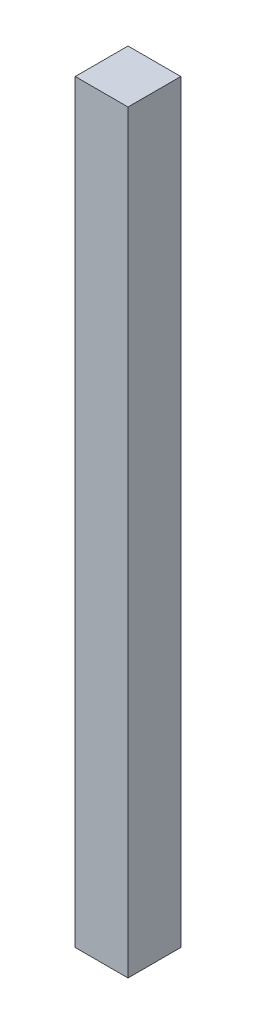
ISO-10303-21;
HEADER;
FILE_DESCRIPTION(('STEP AP214'),'2;1');
FILE_NAME('part.step','',(''),(''),'','','');
FILE_SCHEMA(('AUTOMOTIVE_DESIGN { 1 0 10303 214 1 1 1 1 }'));
ENDSEC;
DATA;
#1=APPLICATION_CONTEXT('core data for automotive mechanical design processes');
#2=APPLICATION_PROTOCOL_DEFINITION('international standard','automotive_design',2000,#1);
#3=PRODUCT_CONTEXT('',#1,'mechanical');
#4=PRODUCT('Part','Part','',(#3));
#5=PRODUCT_RELATED_PRODUCT_CATEGORY('part','',(#4));
#6=PRODUCT_DEFINITION_FORMATION('','',#4);
#7=PRODUCT_DEFINITION_CONTEXT('part definition',#1,'design');
#8=PRODUCT_DEFINITION('design','',#6,#7);
#9=PRODUCT_DEFINITION_SHAPE('','',#8);
#10=(LENGTH_UNIT() NAMED_UNIT(*) SI_UNIT(.MILLI.,.METRE.));
#11=(NAMED_UNIT(*) PLANE_ANGLE_UNIT() SI_UNIT($,.RADIAN.));
#12=(NAMED_UNIT(*) SI_UNIT($,.STERADIAN.) SOLID_ANGLE_UNIT());
#13=UNCERTAINTY_MEASURE_WITH_UNIT(LENGTH_MEASURE(1.E-05),#10,'distance_accuracy_value','');
#14=(GEOMETRIC_REPRESENTATION_CONTEXT(3) GLOBAL_UNCERTAINTY_ASSIGNED_CONTEXT((#13)) GLOBAL_UNIT_ASSIGNED_CONTEXT((#10,
#11,#12)) REPRESENTATION_CONTEXT('',''));
#15=CARTESIAN_POINT('',(0.,0.,0.));
#16=DIRECTION('',(0.,0.,1.));
#17=DIRECTION('',(1.,0.,0.));
#18=AXIS2_PLACEMENT_3D('',#15,#16,#17);
#19=CARTESIAN_POINT('',(-500.,-500.,500.));
#20=DIRECTION('',(-1.,0.,0.));
#21=DIRECTION('',(0.,0.,1.));
#22=AXIS2_PLACEMENT_3D('',#19,#20,#21);
#23=PLANE('',#22);
#24=DIRECTION('',(0.,0.,1.));
#25=VECTOR('',#24,1.);
#26=CARTESIAN_POINT('',(-500.,0.,500.));
#27=LINE('',#26,#25);
#28=CARTESIAN_POINT('',(-500.,0.,465.));
#29=VERTEX_POINT('',#28);
#30=CARTESIAN_POINT('',(-500.,0.,500.));
#31=VERTEX_POINT('',#30);
#32=EDGE_CURVE('E96',#29,#31,#27,.T.);
#33=ORIENTED_EDGE('',*,*,#32,.F.);
#34=DIRECTION('',(0.,1.,0.));
#35=VECTOR('',#34,1.);
#36=CARTESIAN_POINT('',(-500.,-500.,465.));
#37=LINE('',#36,#35);
#38=CARTESIAN_POINT('',(-500.,-500.,465.));
#39=VERTEX_POINT('',#38);
#40=EDGE_CURVE('E11',#39,#29,#37,.T.);
#41=ORIENTED_EDGE('',*,*,#40,.F.);
#42=DIRECTION('',(0.,0.,1.));
#43=VECTOR('',#42,1.);
#44=CARTESIAN_POINT('',(-500.,-500.,500.));
#45=LINE('',#44,#43);
#46=CARTESIAN_POINT('',(-500.,-500.,500.));
#47=VERTEX_POINT('',#46);
#48=EDGE_CURVE('E90',#39,#47,#45,.T.);
#49=ORIENTED_EDGE('',*,*,#48,.T.);
#50=DIRECTION('',(0.,1.,0.));
#51=VECTOR('',#50,1.);
#52=CARTESIAN_POINT('',(-500.,-500.,500.));
#53=LINE('',#52,#51);
#54=EDGE_CURVE('E35',#47,#31,#53,.T.);
#55=ORIENTED_EDGE('',*,*,#54,.T.);
#56=EDGE_LOOP('',(#33,#41,#49,#55));
#57=FACE_BOUND('',#56,.T.);
#58=ADVANCED_FACE('F32',(#57),#23,.T.);
#59=CARTESIAN_POINT('',(-500.,-500.,465.));
#60=DIRECTION('',(0.,0.,-1.));
#61=DIRECTION('',(-1.,0.,0.));
#62=AXIS2_PLACEMENT_3D('',#59,#60,#61);
#63=PLANE('',#62);
#64=DIRECTION('',(-1.,0.,0.));
#65=VECTOR('',#64,1.);
#66=CARTESIAN_POINT('',(-500.,0.,465.));
#67=LINE('',#66,#65);
#68=CARTESIAN_POINT('',(-465.,0.,465.));
#69=VERTEX_POINT('',#68);
#70=EDGE_CURVE('E92',#69,#29,#67,.T.);
#71=ORIENTED_EDGE('',*,*,#70,.F.);
#72=DIRECTION('',(0.,1.,0.));
#73=VECTOR('',#72,1.);
#74=CARTESIAN_POINT('',(-465.,-500.,465.));
#75=LINE('',#74,#73);
#76=CARTESIAN_POINT('',(-465.,-500.,465.));
#77=VERTEX_POINT('',#76);
#78=EDGE_CURVE('E41',#77,#69,#75,.T.);
#79=ORIENTED_EDGE('',*,*,#78,.F.);
#80=DIRECTION('',(-1.,0.,0.));
#81=VECTOR('',#80,1.);
#82=CARTESIAN_POINT('',(-500.,-500.,465.));
#83=LINE('',#82,#81);
#84=EDGE_CURVE('E87',#77,#39,#83,.T.);
#85=ORIENTED_EDGE('',*,*,#84,.T.);
#86=ORIENTED_EDGE('',*,*,#40,.T.);
#87=EDGE_LOOP('',(#71,#79,#85,#86));
#88=FACE_BOUND('',#87,.T.);
#89=ADVANCED_FACE('F106',(#88),#63,.T.);
#90=CARTESIAN_POINT('',(-465.,-500.,500.));
#91=DIRECTION('',(1.,0.,0.));
#92=DIRECTION('',(0.,0.,-1.));
#93=AXIS2_PLACEMENT_3D('',#90,#91,#92);
#94=PLANE('',#93);
#95=DIRECTION('',(0.,0.,-1.));
#96=VECTOR('',#95,1.);
#97=CARTESIAN_POINT('',(-465.,0.,500.));
#98=LINE('',#97,#96);
#99=CARTESIAN_POINT('',(-465.,0.,500.));
#100=VERTEX_POINT('',#99);
#101=EDGE_CURVE('E82',#100,#69,#98,.T.);
#102=ORIENTED_EDGE('',*,*,#101,.F.);
#103=DIRECTION('',(0.,1.,0.));
#104=VECTOR('',#103,1.);
#105=CARTESIAN_POINT('',(-465.,-500.,500.));
#106=LINE('',#105,#104);
#107=CARTESIAN_POINT('',(-465.,-500.,500.));
#108=VERTEX_POINT('',#107);
#109=EDGE_CURVE('E77',#108,#100,#106,.T.);
#110=ORIENTED_EDGE('',*,*,#109,.F.);
#111=DIRECTION('',(0.,0.,-1.));
#112=VECTOR('',#111,1.);
#113=CARTESIAN_POINT('',(-465.,-500.,500.));
#114=LINE('',#113,#112);
#115=EDGE_CURVE('E80',#108,#77,#114,.T.);
#116=ORIENTED_EDGE('',*,*,#115,.T.);
#117=ORIENTED_EDGE('',*,*,#78,.T.);
#118=EDGE_LOOP('',(#102,#110,#116,#117));
#119=FACE_BOUND('',#118,.T.);
#120=ADVANCED_FACE('F79',(#119),#94,.T.);
#121=CARTESIAN_POINT('',(-500.,-500.,500.));
#122=DIRECTION('',(0.,0.,1.));
#123=DIRECTION('',(1.,0.,0.));
#124=AXIS2_PLACEMENT_3D('',#121,#122,#123);
#125=PLANE('',#124);
#126=DIRECTION('',(1.,0.,0.));
#127=VECTOR('',#126,1.);
#128=CARTESIAN_POINT('',(-500.,0.,500.));
#129=LINE('',#128,#127);
#130=EDGE_CURVE('E99',#31,#100,#129,.T.);
#131=ORIENTED_EDGE('',*,*,#130,.F.);
#132=ORIENTED_EDGE('',*,*,#54,.F.);
#133=DIRECTION('',(1.,0.,0.));
#134=VECTOR('',#133,1.);
#135=CARTESIAN_POINT('',(-500.,-500.,500.));
#136=LINE('',#135,#134);
#137=EDGE_CURVE('E86',#47,#108,#136,.T.);
#138=ORIENTED_EDGE('',*,*,#137,.T.);
#139=ORIENTED_EDGE('',*,*,#109,.T.);
#140=EDGE_LOOP('',(#131,#132,#138,#139));
#141=FACE_BOUND('',#140,.T.);
#142=ADVANCED_FACE('F89',(#141),#125,.T.);
#143=CARTESIAN_POINT('',(0.,-500.,0.));
#144=DIRECTION('',(0.,-1.,0.));
#145=DIRECTION('',(0.,0.,-1.));
#146=AXIS2_PLACEMENT_3D('',#143,#144,#145);
#147=PLANE('',#146);
#148=ORIENTED_EDGE('',*,*,#48,.F.);
#149=ORIENTED_EDGE('',*,*,#84,.F.);
#150=ORIENTED_EDGE('',*,*,#115,.F.);
#151=ORIENTED_EDGE('',*,*,#137,.F.);
#152=EDGE_LOOP('',(#148,#149,#150,#151));
#153=FACE_BOUND('',#152,.T.);
#154=ADVANCED_FACE('F85',(#153),#147,.T.);
#155=CARTESIAN_POINT('',(0.,0.,0.));
#156=DIRECTION('',(0.,-1.,0.));
#157=DIRECTION('',(0.,0.,-1.));
#158=AXIS2_PLACEMENT_3D('',#155,#156,#157);
#159=PLANE('',#158);
#160=ORIENTED_EDGE('',*,*,#32,.T.);
#161=ORIENTED_EDGE('',*,*,#130,.T.);
#162=ORIENTED_EDGE('',*,*,#101,.T.);
#163=ORIENTED_EDGE('',*,*,#70,.T.);
#164=EDGE_LOOP('',(#160,#161,#162,#163));
#165=FACE_BOUND('',#164,.T.);
#166=ADVANCED_FACE('F105',(#165),#159,.F.);
#167=CLOSED_SHELL('',(#58,#89,#120,#142,#154,#166));
#168=MANIFOLD_SOLID_BREP('B2',#167);
#169=ADVANCED_BREP_SHAPE_REPRESENTATION('',(#18,#168),#14);
#170=SHAPE_DEFINITION_REPRESENTATION(#9,#169);
ENDSEC;
END-ISO-10303-21;
